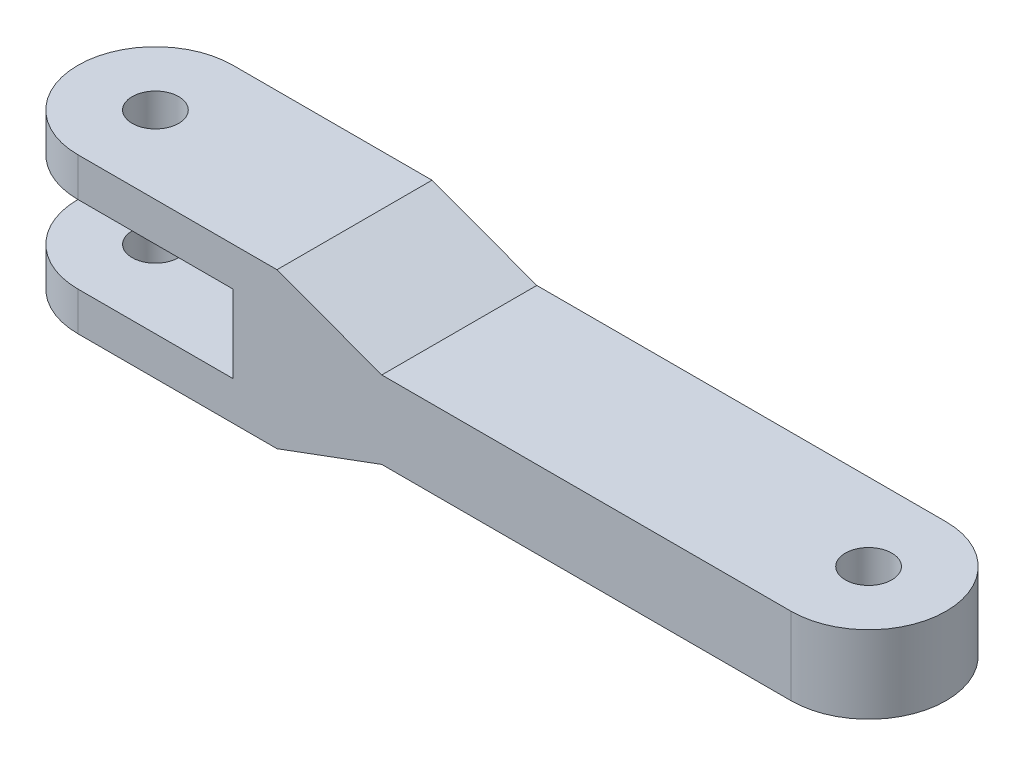
ISO-10303-21;
HEADER;
FILE_DESCRIPTION(('STEP AP214'),'2;1');
FILE_NAME('part.step','',(''),(''),'','','');
FILE_SCHEMA(('AUTOMOTIVE_DESIGN { 1 0 10303 214 1 1 1 1 }'));
ENDSEC;
DATA;
#1=APPLICATION_CONTEXT('core data for automotive mechanical design processes');
#2=APPLICATION_PROTOCOL_DEFINITION('international standard','automotive_design',2000,#1);
#3=PRODUCT_CONTEXT('',#1,'mechanical');
#4=PRODUCT('Part','Part','',(#3));
#5=PRODUCT_RELATED_PRODUCT_CATEGORY('part','',(#4));
#6=PRODUCT_DEFINITION_FORMATION('','',#4);
#7=PRODUCT_DEFINITION_CONTEXT('part definition',#1,'design');
#8=PRODUCT_DEFINITION('design','',#6,#7);
#9=PRODUCT_DEFINITION_SHAPE('','',#8);
#10=(LENGTH_UNIT() NAMED_UNIT(*) SI_UNIT(.MILLI.,.METRE.));
#11=(NAMED_UNIT(*) PLANE_ANGLE_UNIT() SI_UNIT($,.RADIAN.));
#12=(NAMED_UNIT(*) SI_UNIT($,.STERADIAN.) SOLID_ANGLE_UNIT());
#13=UNCERTAINTY_MEASURE_WITH_UNIT(LENGTH_MEASURE(1.E-05),#10,'distance_accuracy_value','');
#14=(GEOMETRIC_REPRESENTATION_CONTEXT(3) GLOBAL_UNCERTAINTY_ASSIGNED_CONTEXT((#13)) GLOBAL_UNIT_ASSIGNED_CONTEXT((#10,
#11,#12)) REPRESENTATION_CONTEXT('',''));
#15=CARTESIAN_POINT('',(0.,0.,0.));
#16=DIRECTION('',(0.,0.,1.));
#17=DIRECTION('',(1.,0.,0.));
#18=AXIS2_PLACEMENT_3D('',#15,#16,#17);
#19=CARTESIAN_POINT('',(0.,0.,10.));
#20=DIRECTION('',(0.,1.,0.));
#21=DIRECTION('',(0.,0.,1.));
#22=AXIS2_PLACEMENT_3D('',#19,#20,#21);
#23=PLANE('',#22);
#24=CARTESIAN_POINT('',(5.,0.,5.));
#25=DIRECTION('',(0.,1.,0.));
#26=DIRECTION('',(0.,0.,1.));
#27=AXIS2_PLACEMENT_3D('',#24,#25,#26);
#28=CIRCLE('',#27,1.5);
#29=CARTESIAN_POINT('',(5.,0.,6.5));
#30=VERTEX_POINT('',#29);
#31=EDGE_CURVE('E219',#30,#30,#28,.T.);
#32=ORIENTED_EDGE('',*,*,#31,.T.);
#33=EDGE_LOOP('',(#32));
#34=FACE_BOUND('',#33,.T.);
#35=DIRECTION('',(1.,0.,0.));
#36=VECTOR('',#35,1.);
#37=CARTESIAN_POINT('',(0.,0.,0.));
#38=LINE('',#37,#36);
#39=CARTESIAN_POINT('',(5.,0.,0.));
#40=VERTEX_POINT('',#39);
#41=CARTESIAN_POINT('',(17.8419899678237,0.,-2.5E-06));
#42=VERTEX_POINT('',#41);
#43=EDGE_CURVE('E228',#40,#42,#38,.T.);
#44=ORIENTED_EDGE('',*,*,#43,.T.);
#45=DIRECTION('',(0.,0.,1.));
#46=VECTOR('',#45,1.);
#47=CARTESIAN_POINT('',(17.8419899678237,0.,-4.99999999997031E-05));
#48=LINE('',#47,#46);
#49=CARTESIAN_POINT('',(17.8419899678237,0.,10.));
#50=VERTEX_POINT('',#49);
#51=EDGE_CURVE('E144',#42,#50,#48,.T.);
#52=ORIENTED_EDGE('',*,*,#51,.T.);
#53=DIRECTION('',(1.,0.,0.));
#54=VECTOR('',#53,1.);
#55=CARTESIAN_POINT('',(0.,0.,10.));
#56=LINE('',#55,#54);
#57=CARTESIAN_POINT('',(5.,0.,10.));
#58=VERTEX_POINT('',#57);
#59=EDGE_CURVE('E143',#58,#50,#56,.T.);
#60=ORIENTED_EDGE('',*,*,#59,.F.);
#61=CARTESIAN_POINT('',(5.,0.,5.));
#62=DIRECTION('',(0.,-1.,0.));
#63=DIRECTION('',(0.,0.,1.));
#64=AXIS2_PLACEMENT_3D('',#61,#62,#63);
#65=CIRCLE('',#64,5.);
#66=EDGE_CURVE('E152',#58,#40,#65,.T.);
#67=ORIENTED_EDGE('',*,*,#66,.T.);
#68=EDGE_LOOP('',(#44,#52,#60,#67));
#69=FACE_BOUND('',#68,.T.);
#70=ADVANCED_FACE('F33',(#34,#69),#23,.F.);
#71=CARTESIAN_POINT('',(0.,10.,10.));
#72=DIRECTION('',(0.,-1.,0.));
#73=DIRECTION('',(0.,0.,-1.));
#74=AXIS2_PLACEMENT_3D('',#71,#72,#73);
#75=PLANE('',#74);
#76=CARTESIAN_POINT('',(5.,10.,5.));
#77=DIRECTION('',(0.,1.,0.));
#78=DIRECTION('',(0.,0.,1.));
#79=AXIS2_PLACEMENT_3D('',#76,#77,#78);
#80=CIRCLE('',#79,1.5);
#81=CARTESIAN_POINT('',(5.,10.,6.5));
#82=VERTEX_POINT('',#81);
#83=EDGE_CURVE('E218',#82,#82,#80,.T.);
#84=ORIENTED_EDGE('',*,*,#83,.F.);
#85=EDGE_LOOP('',(#84));
#86=FACE_BOUND('',#85,.T.);
#87=DIRECTION('',(-1.,0.,0.));
#88=VECTOR('',#87,1.);
#89=CARTESIAN_POINT('',(0.,10.,10.));
#90=LINE('',#89,#88);
#91=CARTESIAN_POINT('',(17.8419899678237,10.,10.));
#92=VERTEX_POINT('',#91);
#93=CARTESIAN_POINT('',(5.,10.,10.));
#94=VERTEX_POINT('',#93);
#95=EDGE_CURVE('E230',#92,#94,#90,.T.);
#96=ORIENTED_EDGE('',*,*,#95,.F.);
#97=DIRECTION('',(0.,0.,1.));
#98=VECTOR('',#97,1.);
#99=CARTESIAN_POINT('',(17.8419899678237,10.,-4.99999999997031E-05));
#100=LINE('',#99,#98);
#101=CARTESIAN_POINT('',(17.8419899678237,10.,-2.5E-06));
#102=VERTEX_POINT('',#101);
#103=EDGE_CURVE('E190',#102,#92,#100,.T.);
#104=ORIENTED_EDGE('',*,*,#103,.F.);
#105=DIRECTION('',(-1.,0.,0.));
#106=VECTOR('',#105,1.);
#107=CARTESIAN_POINT('',(0.,10.,0.));
#108=LINE('',#107,#106);
#109=CARTESIAN_POINT('',(5.,10.,0.));
#110=VERTEX_POINT('',#109);
#111=EDGE_CURVE('E158',#102,#110,#108,.T.);
#112=ORIENTED_EDGE('',*,*,#111,.T.);
#113=CARTESIAN_POINT('',(5.,10.,5.));
#114=DIRECTION('',(0.,-1.,0.));
#115=DIRECTION('',(0.,0.,1.));
#116=AXIS2_PLACEMENT_3D('',#113,#114,#115);
#117=CIRCLE('',#116,5.);
#118=EDGE_CURVE('E149',#94,#110,#117,.T.);
#119=ORIENTED_EDGE('',*,*,#118,.F.);
#120=EDGE_LOOP('',(#96,#104,#112,#119));
#121=FACE_BOUND('',#120,.T.);
#122=ADVANCED_FACE('F293',(#86,#121),#75,.F.);
#123=CARTESIAN_POINT('',(0.,7.50000000000001,10.));
#124=DIRECTION('',(0.,1.,0.));
#125=DIRECTION('',(0.,0.,1.));
#126=AXIS2_PLACEMENT_3D('',#123,#124,#125);
#127=PLANE('',#126);
#128=CARTESIAN_POINT('',(5.,7.50000000000001,5.));
#129=DIRECTION('',(0.,1.,0.));
#130=DIRECTION('',(0.,0.,1.));
#131=AXIS2_PLACEMENT_3D('',#128,#129,#130);
#132=CIRCLE('',#131,1.5);
#133=CARTESIAN_POINT('',(5.,7.50000000000001,6.5));
#134=VERTEX_POINT('',#133);
#135=EDGE_CURVE('E225',#134,#134,#132,.T.);
#136=ORIENTED_EDGE('',*,*,#135,.T.);
#137=EDGE_LOOP('',(#136));
#138=FACE_BOUND('',#137,.T.);
#139=DIRECTION('',(1.,0.,0.));
#140=VECTOR('',#139,1.);
#141=CARTESIAN_POINT('',(0.,7.50000000000001,10.));
#142=LINE('',#141,#140);
#143=CARTESIAN_POINT('',(5.,7.50000000000001,10.));
#144=VERTEX_POINT('',#143);
#145=CARTESIAN_POINT('',(15.,7.50000000000001,10.));
#146=VERTEX_POINT('',#145);
#147=EDGE_CURVE('E233',#144,#146,#142,.T.);
#148=ORIENTED_EDGE('',*,*,#147,.F.);
#149=CARTESIAN_POINT('',(5.,7.50000000000001,5.));
#150=DIRECTION('',(0.,1.,0.));
#151=DIRECTION('',(0.,0.,1.));
#152=AXIS2_PLACEMENT_3D('',#149,#150,#151);
#153=CIRCLE('',#152,5.);
#154=CARTESIAN_POINT('',(5.,7.50000000000001,0.));
#155=VERTEX_POINT('',#154);
#156=EDGE_CURVE('E215',#144,#155,#153,.F.);
#157=ORIENTED_EDGE('',*,*,#156,.T.);
#158=DIRECTION('',(1.,0.,0.));
#159=VECTOR('',#158,1.);
#160=CARTESIAN_POINT('',(0.,7.50000000000001,0.));
#161=LINE('',#160,#159);
#162=CARTESIAN_POINT('',(15.,7.50000000000001,0.));
#163=VERTEX_POINT('',#162);
#164=EDGE_CURVE('E271',#155,#163,#161,.T.);
#165=ORIENTED_EDGE('',*,*,#164,.T.);
#166=DIRECTION('',(0.,0.,-1.));
#167=VECTOR('',#166,1.);
#168=CARTESIAN_POINT('',(15.,7.50000000000001,10.));
#169=LINE('',#168,#167);
#170=EDGE_CURVE('E275',#146,#163,#169,.T.);
#171=ORIENTED_EDGE('',*,*,#170,.F.);
#172=EDGE_LOOP('',(#148,#157,#165,#171));
#173=FACE_BOUND('',#172,.T.);
#174=ADVANCED_FACE('F289',(#138,#173),#127,.F.);
#175=CARTESIAN_POINT('',(15.,7.50000000000001,10.));
#176=DIRECTION('',(1.,0.,0.));
#177=DIRECTION('',(0.,0.,-1.));
#178=AXIS2_PLACEMENT_3D('',#175,#176,#177);
#179=PLANE('',#178);
#180=DIRECTION('',(0.,-1.,0.));
#181=VECTOR('',#180,1.);
#182=CARTESIAN_POINT('',(15.,7.50000000000001,0.));
#183=LINE('',#182,#181);
#184=CARTESIAN_POINT('',(15.,2.50000000000001,0.));
#185=VERTEX_POINT('',#184);
#186=EDGE_CURVE('E269',#163,#185,#183,.T.);
#187=ORIENTED_EDGE('',*,*,#186,.T.);
#188=DIRECTION('',(0.,0.,-1.));
#189=VECTOR('',#188,1.);
#190=CARTESIAN_POINT('',(15.,2.50000000000001,10.));
#191=LINE('',#190,#189);
#192=CARTESIAN_POINT('',(15.,2.50000000000001,10.));
#193=VERTEX_POINT('',#192);
#194=EDGE_CURVE('E240',#193,#185,#191,.T.);
#195=ORIENTED_EDGE('',*,*,#194,.F.);
#196=DIRECTION('',(0.,-1.,0.));
#197=VECTOR('',#196,1.);
#198=CARTESIAN_POINT('',(15.,7.50000000000001,10.));
#199=LINE('',#198,#197);
#200=EDGE_CURVE('E235',#146,#193,#199,.T.);
#201=ORIENTED_EDGE('',*,*,#200,.F.);
#202=ORIENTED_EDGE('',*,*,#170,.T.);
#203=EDGE_LOOP('',(#187,#195,#201,#202));
#204=FACE_BOUND('',#203,.T.);
#205=ADVANCED_FACE('F296',(#204),#179,.F.);
#206=CARTESIAN_POINT('',(0.,2.50000000000001,10.));
#207=DIRECTION('',(0.,-1.,0.));
#208=DIRECTION('',(0.,0.,-1.));
#209=AXIS2_PLACEMENT_3D('',#206,#207,#208);
#210=PLANE('',#209);
#211=CARTESIAN_POINT('',(5.,2.50000000000001,5.));
#212=DIRECTION('',(0.,-1.,0.));
#213=DIRECTION('',(0.,0.,-1.));
#214=AXIS2_PLACEMENT_3D('',#211,#212,#213);
#215=CIRCLE('',#214,1.5);
#216=CARTESIAN_POINT('',(5.,2.50000000000001,3.5));
#217=VERTEX_POINT('',#216);
#218=EDGE_CURVE('E222',#217,#217,#215,.T.);
#219=ORIENTED_EDGE('',*,*,#218,.T.);
#220=EDGE_LOOP('',(#219));
#221=FACE_BOUND('',#220,.T.);
#222=DIRECTION('',(-1.,0.,0.));
#223=VECTOR('',#222,1.);
#224=CARTESIAN_POINT('',(0.,2.50000000000001,0.));
#225=LINE('',#224,#223);
#226=CARTESIAN_POINT('',(5.,2.50000000000001,0.));
#227=VERTEX_POINT('',#226);
#228=EDGE_CURVE('E231',#185,#227,#225,.T.);
#229=ORIENTED_EDGE('',*,*,#228,.T.);
#230=CARTESIAN_POINT('',(5.,2.50000000000001,5.));
#231=DIRECTION('',(0.,-1.,0.));
#232=DIRECTION('',(0.,0.,-1.));
#233=AXIS2_PLACEMENT_3D('',#230,#231,#232);
#234=CIRCLE('',#233,5.);
#235=CARTESIAN_POINT('',(5.,2.50000000000001,10.));
#236=VERTEX_POINT('',#235);
#237=EDGE_CURVE('E210',#227,#236,#234,.F.);
#238=ORIENTED_EDGE('',*,*,#237,.T.);
#239=DIRECTION('',(-1.,0.,0.));
#240=VECTOR('',#239,1.);
#241=CARTESIAN_POINT('',(0.,2.50000000000001,10.));
#242=LINE('',#241,#240);
#243=EDGE_CURVE('E237',#193,#236,#242,.T.);
#244=ORIENTED_EDGE('',*,*,#243,.F.);
#245=ORIENTED_EDGE('',*,*,#194,.T.);
#246=EDGE_LOOP('',(#229,#238,#244,#245));
#247=FACE_BOUND('',#246,.T.);
#248=ADVANCED_FACE('F266',(#221,#247),#210,.F.);
#249=CARTESIAN_POINT('',(0.,0.,10.));
#250=DIRECTION('',(0.,0.,-1.));
#251=DIRECTION('',(-1.,0.,0.));
#252=AXIS2_PLACEMENT_3D('',#249,#250,#251);
#253=PLANE('',#252);
#254=ORIENTED_EDGE('',*,*,#59,.T.);
#255=DIRECTION('',(-0.937882784867234,-0.346952276040498,0.));
#256=VECTOR('',#255,1.);
#257=CARTESIAN_POINT('',(24.6,2.5,10.));
#258=LINE('',#257,#256);
#259=CARTESIAN_POINT('',(24.6,2.5,10.));
#260=VERTEX_POINT('',#259);
#261=EDGE_CURVE('E124',#260,#50,#258,.T.);
#262=ORIENTED_EDGE('',*,*,#261,.F.);
#263=DIRECTION('',(-1.,0.,0.));
#264=VECTOR('',#263,1.);
#265=CARTESIAN_POINT('',(24.6,2.5,10.));
#266=LINE('',#265,#264);
#267=CARTESIAN_POINT('',(51.,2.5,10.));
#268=VERTEX_POINT('',#267);
#269=EDGE_CURVE('E140',#268,#260,#266,.T.);
#270=ORIENTED_EDGE('',*,*,#269,.F.);
#271=DIRECTION('',(0.,-1.,0.));
#272=VECTOR('',#271,1.);
#273=CARTESIAN_POINT('',(51.,12.5,10.));
#274=LINE('',#273,#272);
#275=CARTESIAN_POINT('',(51.,7.5,10.));
#276=VERTEX_POINT('',#275);
#277=EDGE_CURVE('E194',#276,#268,#274,.T.);
#278=ORIENTED_EDGE('',*,*,#277,.F.);
#279=DIRECTION('',(-1.,0.,0.));
#280=VECTOR('',#279,1.);
#281=CARTESIAN_POINT('',(24.6,7.5,10.));
#282=LINE('',#281,#280);
#283=CARTESIAN_POINT('',(24.6,7.5,10.));
#284=VERTEX_POINT('',#283);
#285=EDGE_CURVE('E133',#276,#284,#282,.T.);
#286=ORIENTED_EDGE('',*,*,#285,.T.);
#287=DIRECTION('',(0.937882784867234,-0.346952276040498,0.));
#288=VECTOR('',#287,1.);
#289=CARTESIAN_POINT('',(24.6,7.5,10.));
#290=LINE('',#289,#288);
#291=EDGE_CURVE('E56',#92,#284,#290,.T.);
#292=ORIENTED_EDGE('',*,*,#291,.F.);
#293=ORIENTED_EDGE('',*,*,#95,.T.);
#294=DIRECTION('',(0.,1.,0.));
#295=VECTOR('',#294,1.);
#296=CARTESIAN_POINT('',(5.,0.,10.));
#297=LINE('',#296,#295);
#298=EDGE_CURVE('E211',#144,#94,#297,.T.);
#299=ORIENTED_EDGE('',*,*,#298,.F.);
#300=ORIENTED_EDGE('',*,*,#147,.T.);
#301=ORIENTED_EDGE('',*,*,#200,.T.);
#302=ORIENTED_EDGE('',*,*,#243,.T.);
#303=EDGE_CURVE('E207',#58,#236,#297,.T.);
#304=ORIENTED_EDGE('',*,*,#303,.F.);
#305=EDGE_LOOP('',(#254,#262,#270,#278,#286,#292,#293,#299,#300,#301,#302,#304));
#306=FACE_BOUND('',#305,.T.);
#307=ADVANCED_FACE('F138',(#306),#253,.F.);
#308=CARTESIAN_POINT('',(0.,0.,0.));
#309=DIRECTION('',(0.,0.,-1.));
#310=DIRECTION('',(-1.,0.,0.));
#311=AXIS2_PLACEMENT_3D('',#308,#309,#310);
#312=PLANE('',#311);
#313=DIRECTION('',(0.937882784867234,0.346952276040498,0.));
#314=VECTOR('',#313,1.);
#315=CARTESIAN_POINT('',(2.14774527632996,-5.80579364959885,0.));
#316=LINE('',#315,#314);
#317=CARTESIAN_POINT('',(24.6,2.5,-2.24999999998515E-05));
#318=VERTEX_POINT('',#317);
#319=EDGE_CURVE('E127',#42,#318,#316,.T.);
#320=ORIENTED_EDGE('',*,*,#319,.F.);
#321=ORIENTED_EDGE('',*,*,#43,.F.);
#322=DIRECTION('',(0.,1.,0.));
#323=VECTOR('',#322,1.);
#324=CARTESIAN_POINT('',(5.,0.,0.));
#325=LINE('',#324,#323);
#326=EDGE_CURVE('E205',#40,#227,#325,.T.);
#327=ORIENTED_EDGE('',*,*,#326,.T.);
#328=ORIENTED_EDGE('',*,*,#228,.F.);
#329=ORIENTED_EDGE('',*,*,#186,.F.);
#330=ORIENTED_EDGE('',*,*,#164,.F.);
#331=DIRECTION('',(0.,1.,0.));
#332=VECTOR('',#331,1.);
#333=CARTESIAN_POINT('',(5.,0.,0.));
#334=LINE('',#333,#332);
#335=EDGE_CURVE('E41',#110,#155,#334,.F.);
#336=ORIENTED_EDGE('',*,*,#335,.F.);
#337=ORIENTED_EDGE('',*,*,#111,.F.);
#338=DIRECTION('',(-0.937882784867234,0.346952276040498,0.));
#339=VECTOR('',#338,1.);
#340=CARTESIAN_POINT('',(5.40175094501884,14.602034831102,0.));
#341=LINE('',#340,#339);
#342=CARTESIAN_POINT('',(24.6,7.5,-2.24999999998515E-05));
#343=VERTEX_POINT('',#342);
#344=EDGE_CURVE('E183',#343,#102,#341,.T.);
#345=ORIENTED_EDGE('',*,*,#344,.F.);
#346=DIRECTION('',(1.,0.,0.));
#347=VECTOR('',#346,1.);
#348=CARTESIAN_POINT('',(24.6,7.5,0.));
#349=LINE('',#348,#347);
#350=CARTESIAN_POINT('',(51.,7.5,0.));
#351=VERTEX_POINT('',#350);
#352=EDGE_CURVE('E171',#343,#351,#349,.T.);
#353=ORIENTED_EDGE('',*,*,#352,.T.);
#354=DIRECTION('',(0.,-1.,0.));
#355=VECTOR('',#354,1.);
#356=CARTESIAN_POINT('',(51.,12.5,0.));
#357=LINE('',#356,#355);
#358=CARTESIAN_POINT('',(51.,2.5,0.));
#359=VERTEX_POINT('',#358);
#360=EDGE_CURVE('E49',#351,#359,#357,.T.);
#361=ORIENTED_EDGE('',*,*,#360,.T.);
#362=DIRECTION('',(1.,0.,0.));
#363=VECTOR('',#362,1.);
#364=CARTESIAN_POINT('',(24.6,2.5,0.));
#365=LINE('',#364,#363);
#366=EDGE_CURVE('E132',#318,#359,#365,.T.);
#367=ORIENTED_EDGE('',*,*,#366,.F.);
#368=EDGE_LOOP('',(#320,#321,#327,#328,#329,#330,#336,#337,#345,#353,#361,#367));
#369=FACE_BOUND('',#368,.T.);
#370=ADVANCED_FACE('F188',(#369),#312,.T.);
#371=CARTESIAN_POINT('',(5.,0.,5.));
#372=DIRECTION('',(0.,1.,0.));
#373=DIRECTION('',(0.,0.,1.));
#374=AXIS2_PLACEMENT_3D('',#371,#372,#373);
#375=CYLINDRICAL_SURFACE('',#374,1.5);
#376=ORIENTED_EDGE('',*,*,#31,.F.);
#377=EDGE_LOOP('',(#376));
#378=FACE_BOUND('',#377,.T.);
#379=ORIENTED_EDGE('',*,*,#218,.F.);
#380=EDGE_LOOP('',(#379));
#381=FACE_BOUND('',#380,.T.);
#382=ADVANCED_FACE('F305',(#378,#381),#375,.F.);
#383=ORIENTED_EDGE('',*,*,#83,.T.);
#384=EDGE_LOOP('',(#383));
#385=FACE_BOUND('',#384,.T.);
#386=ORIENTED_EDGE('',*,*,#135,.F.);
#387=EDGE_LOOP('',(#386));
#388=FACE_BOUND('',#387,.T.);
#389=ADVANCED_FACE('F299',(#385,#388),#375,.F.);
#390=CARTESIAN_POINT('',(5.,0.,5.));
#391=DIRECTION('',(0.,1.,0.));
#392=DIRECTION('',(0.,0.,1.));
#393=AXIS2_PLACEMENT_3D('',#390,#391,#392);
#394=CYLINDRICAL_SURFACE('',#393,5.);
#395=ORIENTED_EDGE('',*,*,#237,.F.);
#396=ORIENTED_EDGE('',*,*,#326,.F.);
#397=ORIENTED_EDGE('',*,*,#66,.F.);
#398=ORIENTED_EDGE('',*,*,#303,.T.);
#399=EDGE_LOOP('',(#395,#396,#397,#398));
#400=FACE_BOUND('',#399,.T.);
#401=ADVANCED_FACE('F297',(#400),#394,.T.);
#402=ORIENTED_EDGE('',*,*,#118,.T.);
#403=ORIENTED_EDGE('',*,*,#335,.T.);
#404=ORIENTED_EDGE('',*,*,#156,.F.);
#405=ORIENTED_EDGE('',*,*,#298,.T.);
#406=EDGE_LOOP('',(#402,#403,#404,#405));
#407=FACE_BOUND('',#406,.T.);
#408=ADVANCED_FACE('F282',(#407),#394,.T.);
#409=CARTESIAN_POINT('',(95.,2.5,5.));
#410=DIRECTION('',(0.,-1.,0.));
#411=DIRECTION('',(0.,0.,-1.));
#412=AXIS2_PLACEMENT_3D('',#409,#410,#411);
#413=PLANE('',#412);
#414=CARTESIAN_POINT('',(51.,2.5,5.));
#415=DIRECTION('',(0.,1.,0.));
#416=DIRECTION('',(0.,0.,-1.));
#417=AXIS2_PLACEMENT_3D('',#414,#415,#416);
#418=CIRCLE('',#417,5.);
#419=EDGE_CURVE('E148',#268,#359,#418,.T.);
#420=ORIENTED_EDGE('',*,*,#419,.F.);
#421=ORIENTED_EDGE('',*,*,#269,.T.);
#422=DIRECTION('',(0.,0.,-1.));
#423=VECTOR('',#422,1.);
#424=CARTESIAN_POINT('',(24.6,2.5,10.));
#425=LINE('',#424,#423);
#426=EDGE_CURVE('E121',#260,#318,#425,.T.);
#427=ORIENTED_EDGE('',*,*,#426,.T.);
#428=ORIENTED_EDGE('',*,*,#366,.T.);
#429=EDGE_LOOP('',(#420,#421,#427,#428));
#430=FACE_BOUND('',#429,.T.);
#431=CARTESIAN_POINT('',(51.,2.5,5.));
#432=DIRECTION('',(0.,-1.,0.));
#433=DIRECTION('',(0.,0.,-1.));
#434=AXIS2_PLACEMENT_3D('',#431,#432,#433);
#435=CIRCLE('',#434,1.5);
#436=CARTESIAN_POINT('',(51.,2.5,3.5));
#437=VERTEX_POINT('',#436);
#438=EDGE_CURVE('E175',#437,#437,#435,.T.);
#439=ORIENTED_EDGE('',*,*,#438,.F.);
#440=EDGE_LOOP('',(#439));
#441=FACE_BOUND('',#440,.T.);
#442=ADVANCED_FACE('F146',(#430,#441),#413,.T.);
#443=CARTESIAN_POINT('',(95.,7.5,5.));
#444=DIRECTION('',(0.,-1.,0.));
#445=DIRECTION('',(0.,0.,-1.));
#446=AXIS2_PLACEMENT_3D('',#443,#444,#445);
#447=PLANE('',#446);
#448=CARTESIAN_POINT('',(51.,7.5,5.));
#449=DIRECTION('',(0.,-1.,0.));
#450=DIRECTION('',(0.,0.,-1.));
#451=AXIS2_PLACEMENT_3D('',#448,#449,#450);
#452=CIRCLE('',#451,1.5);
#453=CARTESIAN_POINT('',(51.,7.5,3.5));
#454=VERTEX_POINT('',#453);
#455=EDGE_CURVE('E172',#454,#454,#452,.T.);
#456=ORIENTED_EDGE('',*,*,#455,.T.);
#457=EDGE_LOOP('',(#456));
#458=FACE_BOUND('',#457,.T.);
#459=ORIENTED_EDGE('',*,*,#285,.F.);
#460=CARTESIAN_POINT('',(51.,7.5,5.));
#461=DIRECTION('',(0.,-1.,0.));
#462=DIRECTION('',(0.,0.,-1.));
#463=AXIS2_PLACEMENT_3D('',#460,#461,#462);
#464=CIRCLE('',#463,5.);
#465=EDGE_CURVE('E11',#276,#351,#464,.F.);
#466=ORIENTED_EDGE('',*,*,#465,.T.);
#467=ORIENTED_EDGE('',*,*,#352,.F.);
#468=DIRECTION('',(0.,0.,-1.));
#469=VECTOR('',#468,1.);
#470=CARTESIAN_POINT('',(24.6,7.5,10.));
#471=LINE('',#470,#469);
#472=EDGE_CURVE('E167',#284,#343,#471,.T.);
#473=ORIENTED_EDGE('',*,*,#472,.F.);
#474=EDGE_LOOP('',(#459,#466,#467,#473));
#475=FACE_BOUND('',#474,.T.);
#476=ADVANCED_FACE('F192',(#458,#475),#447,.F.);
#477=CARTESIAN_POINT('',(51.,12.5,5.));
#478=DIRECTION('',(0.,-1.,0.));
#479=DIRECTION('',(0.,0.,-1.));
#480=AXIS2_PLACEMENT_3D('',#477,#478,#479);
#481=CYLINDRICAL_SURFACE('',#480,1.5);
#482=ORIENTED_EDGE('',*,*,#438,.T.);
#483=EDGE_LOOP('',(#482));
#484=FACE_BOUND('',#483,.T.);
#485=ORIENTED_EDGE('',*,*,#455,.F.);
#486=EDGE_LOOP('',(#485));
#487=FACE_BOUND('',#486,.T.);
#488=ADVANCED_FACE('F417',(#484,#487),#481,.F.);
#489=CARTESIAN_POINT('',(51.,12.5,5.));
#490=DIRECTION('',(0.,-1.,0.));
#491=DIRECTION('',(0.,0.,-1.));
#492=AXIS2_PLACEMENT_3D('',#489,#490,#491);
#493=CYLINDRICAL_SURFACE('',#492,5.);
#494=ORIENTED_EDGE('',*,*,#277,.T.);
#495=ORIENTED_EDGE('',*,*,#419,.T.);
#496=ORIENTED_EDGE('',*,*,#360,.F.);
#497=ORIENTED_EDGE('',*,*,#465,.F.);
#498=EDGE_LOOP('',(#494,#495,#496,#497));
#499=FACE_BOUND('',#498,.T.);
#500=ADVANCED_FACE('F193',(#499),#493,.T.);
#501=CARTESIAN_POINT('',(24.6,7.5,-4.99999999997031E-05));
#502=DIRECTION('',(-0.346952276040498,-0.937882784867234,0.));
#503=DIRECTION('',(0.937882784867234,-0.346952276040498,0.));
#504=AXIS2_PLACEMENT_3D('',#501,#502,#503);
#505=PLANE('',#504);
#506=ORIENTED_EDGE('',*,*,#344,.T.);
#507=ORIENTED_EDGE('',*,*,#103,.T.);
#508=ORIENTED_EDGE('',*,*,#291,.T.);
#509=ORIENTED_EDGE('',*,*,#472,.T.);
#510=EDGE_LOOP('',(#506,#507,#508,#509));
#511=FACE_BOUND('',#510,.T.);
#512=ADVANCED_FACE('F182',(#511),#505,.F.);
#513=CARTESIAN_POINT('',(24.6,2.5,-4.99999999997031E-05));
#514=DIRECTION('',(-0.346952276040498,0.937882784867234,0.));
#515=DIRECTION('',(-0.937882784867234,-0.346952276040498,0.));
#516=AXIS2_PLACEMENT_3D('',#513,#514,#515);
#517=PLANE('',#516);
#518=ORIENTED_EDGE('',*,*,#319,.T.);
#519=ORIENTED_EDGE('',*,*,#426,.F.);
#520=ORIENTED_EDGE('',*,*,#261,.T.);
#521=ORIENTED_EDGE('',*,*,#51,.F.);
#522=EDGE_LOOP('',(#518,#519,#520,#521));
#523=FACE_BOUND('',#522,.T.);
#524=ADVANCED_FACE('F123',(#523),#517,.F.);
#525=CLOSED_SHELL('',(#70,#122,#174,#205,#248,#307,#370,#382,#389,#401,#408,#442,#476,#488,#500,
#512,#524));
#526=MANIFOLD_SOLID_BREP('B2',#525);
#527=ADVANCED_BREP_SHAPE_REPRESENTATION('',(#18,#526),#14);
#528=SHAPE_DEFINITION_REPRESENTATION(#9,#527);
ENDSEC;
END-ISO-10303-21;
